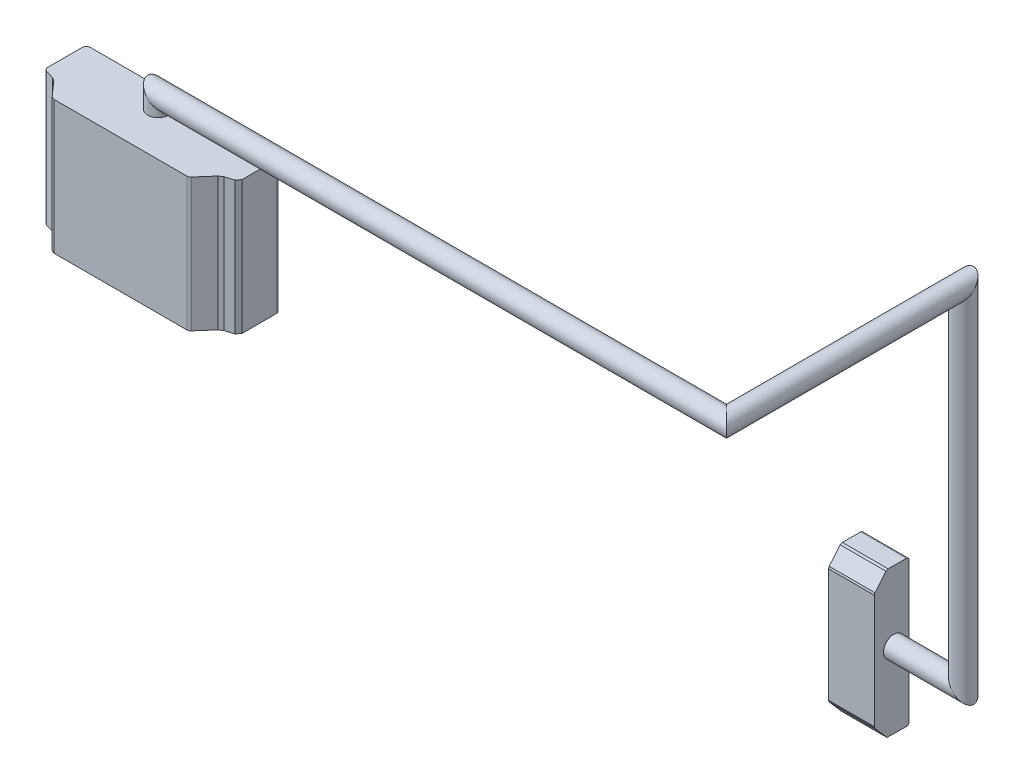
ISO-10303-21;
HEADER;
FILE_DESCRIPTION(('STEP AP214'),'2;1');
FILE_NAME('part.step','',(''),(''),'','','');
FILE_SCHEMA(('AUTOMOTIVE_DESIGN { 1 0 10303 214 1 1 1 1 }'));
ENDSEC;
DATA;
#1=APPLICATION_CONTEXT('core data for automotive mechanical design processes');
#2=APPLICATION_PROTOCOL_DEFINITION('international standard','automotive_design',2000,#1);
#3=PRODUCT_CONTEXT('',#1,'mechanical');
#4=PRODUCT('Part','Part','',(#3));
#5=PRODUCT_RELATED_PRODUCT_CATEGORY('part','',(#4));
#6=PRODUCT_DEFINITION_FORMATION('','',#4);
#7=PRODUCT_DEFINITION_CONTEXT('part definition',#1,'design');
#8=PRODUCT_DEFINITION('design','',#6,#7);
#9=PRODUCT_DEFINITION_SHAPE('','',#8);
#10=(LENGTH_UNIT() NAMED_UNIT(*) SI_UNIT(.MILLI.,.METRE.));
#11=(NAMED_UNIT(*) PLANE_ANGLE_UNIT() SI_UNIT($,.RADIAN.));
#12=(NAMED_UNIT(*) SI_UNIT($,.STERADIAN.) SOLID_ANGLE_UNIT());
#13=UNCERTAINTY_MEASURE_WITH_UNIT(LENGTH_MEASURE(1.E-05),#10,'distance_accuracy_value','');
#14=(GEOMETRIC_REPRESENTATION_CONTEXT(3) GLOBAL_UNCERTAINTY_ASSIGNED_CONTEXT((#13)) GLOBAL_UNIT_ASSIGNED_CONTEXT((#10,
#11,#12)) REPRESENTATION_CONTEXT('',''));
#15=CARTESIAN_POINT('',(0.,0.,0.));
#16=DIRECTION('',(0.,0.,1.));
#17=DIRECTION('',(1.,0.,0.));
#18=AXIS2_PLACEMENT_3D('',#15,#16,#17);
#19=CARTESIAN_POINT('',(-35.94,25.995,17.06));
#20=DIRECTION('',(0.,-1.,0.));
#21=DIRECTION('',(0.,0.,-1.));
#22=AXIS2_PLACEMENT_3D('',#19,#20,#21);
#23=CYLINDRICAL_SURFACE('',#22,0.75);
#24=CARTESIAN_POINT('',(-35.94,25.07,17.06));
#25=DIRECTION('',(-0.707106781186548,-0.707106781186548,0.));
#26=DIRECTION('',(-0.707106781186548,0.707106781186548,0.));
#27=AXIS2_PLACEMENT_3D('',#24,#25,#26);
#28=ELLIPSE('',#27,1.06066017177982,0.75);
#29=CARTESIAN_POINT('',(-36.69,25.82,17.06));
#30=VERTEX_POINT('',#29);
#31=EDGE_CURVE('E271',#30,#30,#28,.F.);
#32=ORIENTED_EDGE('',*,*,#31,.F.);
#33=EDGE_LOOP('',(#32));
#34=FACE_BOUND('',#33,.T.);
#35=CARTESIAN_POINT('',(-35.94,24.07,17.06));
#36=DIRECTION('',(0.,-1.,0.));
#37=DIRECTION('',(-1.,0.,0.));
#38=AXIS2_PLACEMENT_3D('',#35,#36,#37);
#39=CIRCLE('',#38,0.75);
#40=CARTESIAN_POINT('',(-36.69,24.07,17.06));
#41=VERTEX_POINT('',#40);
#42=EDGE_CURVE('E46',#41,#41,#39,.T.);
#43=ORIENTED_EDGE('',*,*,#42,.F.);
#44=EDGE_LOOP('',(#43));
#45=FACE_BOUND('',#44,.T.);
#46=ADVANCED_FACE('F43',(#34,#45),#23,.T.);
#47=CARTESIAN_POINT('',(6.75000000000001,25.07,17.06));
#48=DIRECTION('',(-1.,0.,0.));
#49=DIRECTION('',(0.,0.,1.));
#50=AXIS2_PLACEMENT_3D('',#47,#48,#49);
#51=CYLINDRICAL_SURFACE('',#50,0.75);
#52=CARTESIAN_POINT('',(5.,25.07,17.06));
#53=DIRECTION('',(-0.707106781186547,0.,0.707106781186548));
#54=DIRECTION('',(0.707106781186548,0.,0.707106781186547));
#55=AXIS2_PLACEMENT_3D('',#52,#53,#54);
#56=ELLIPSE('',#55,1.06066017177982,0.75);
#57=CARTESIAN_POINT('',(5.75,25.07,17.81));
#58=VERTEX_POINT('',#57);
#59=EDGE_CURVE('E269',#58,#58,#56,.F.);
#60=ORIENTED_EDGE('',*,*,#59,.F.);
#61=EDGE_LOOP('',(#60));
#62=FACE_BOUND('',#61,.T.);
#63=ORIENTED_EDGE('',*,*,#31,.T.);
#64=EDGE_LOOP('',(#63));
#65=FACE_BOUND('',#64,.T.);
#66=ADVANCED_FACE('F282',(#62,#65),#51,.T.);
#67=CARTESIAN_POINT('',(5.,25.07,-0.924999999999997));
#68=DIRECTION('',(0.,0.,1.));
#69=DIRECTION('',(1.,0.,0.));
#70=AXIS2_PLACEMENT_3D('',#67,#68,#69);
#71=CYLINDRICAL_SURFACE('',#70,0.75);
#72=CARTESIAN_POINT('',(5.,25.07,0.));
#73=DIRECTION('',(0.,0.707106781186548,0.707106781186548));
#74=DIRECTION('',(0.,0.707106781186548,-0.707106781186548));
#75=AXIS2_PLACEMENT_3D('',#72,#73,#74);
#76=ELLIPSE('',#75,1.06066017177982,0.75);
#77=CARTESIAN_POINT('',(5.,25.82,-0.75));
#78=VERTEX_POINT('',#77);
#79=EDGE_CURVE('E52',#78,#78,#76,.F.);
#80=ORIENTED_EDGE('',*,*,#79,.F.);
#81=EDGE_LOOP('',(#80));
#82=FACE_BOUND('',#81,.T.);
#83=ORIENTED_EDGE('',*,*,#59,.T.);
#84=EDGE_LOOP('',(#83));
#85=FACE_BOUND('',#84,.T.);
#86=ADVANCED_FACE('F288',(#82,#85),#71,.T.);
#87=CARTESIAN_POINT('',(5.,-1.75,0.));
#88=DIRECTION('',(0.,1.,0.));
#89=DIRECTION('',(0.,0.,1.));
#90=AXIS2_PLACEMENT_3D('',#87,#88,#89);
#91=CYLINDRICAL_SURFACE('',#90,0.75);
#92=CARTESIAN_POINT('',(5.,0.,0.));
#93=DIRECTION('',(0.707106781186548,0.707106781186548,0.));
#94=DIRECTION('',(0.707106781186548,-0.707106781186548,0.));
#95=AXIS2_PLACEMENT_3D('',#92,#93,#94);
#96=ELLIPSE('',#95,1.06066017177982,0.75);
#97=CARTESIAN_POINT('',(5.75,-0.75,0.));
#98=VERTEX_POINT('',#97);
#99=EDGE_CURVE('E11',#98,#98,#96,.F.);
#100=ORIENTED_EDGE('',*,*,#99,.F.);
#101=EDGE_LOOP('',(#100));
#102=FACE_BOUND('',#101,.T.);
#103=ORIENTED_EDGE('',*,*,#79,.T.);
#104=EDGE_LOOP('',(#103));
#105=FACE_BOUND('',#104,.T.);
#106=ADVANCED_FACE('F296',(#102,#105),#91,.T.);
#107=CARTESIAN_POINT('',(0.,0.,0.));
#108=DIRECTION('',(1.,0.,0.));
#109=DIRECTION('',(0.,0.,-1.));
#110=AXIS2_PLACEMENT_3D('',#107,#108,#109);
#111=CYLINDRICAL_SURFACE('',#110,0.75);
#112=CARTESIAN_POINT('',(0.,0.,0.));
#113=DIRECTION('',(1.,0.,0.));
#114=DIRECTION('',(0.,0.,-1.));
#115=AXIS2_PLACEMENT_3D('',#112,#113,#114);
#116=CIRCLE('',#115,0.75);
#117=CARTESIAN_POINT('',(0.,0.,-0.75));
#118=VERTEX_POINT('',#117);
#119=EDGE_CURVE('E198',#118,#118,#116,.T.);
#120=ORIENTED_EDGE('',*,*,#119,.T.);
#121=EDGE_LOOP('',(#120));
#122=FACE_BOUND('',#121,.T.);
#123=ORIENTED_EDGE('',*,*,#99,.T.);
#124=EDGE_LOOP('',(#123));
#125=FACE_BOUND('',#124,.T.);
#126=ADVANCED_FACE('F292',(#122,#125),#111,.T.);
#127=CARTESIAN_POINT('',(-28.8290699893797,14.47,15.9518178306034));
#128=DIRECTION('',(0.,1.,0.));
#129=DIRECTION('',(0.,0.,1.));
#130=AXIS2_PLACEMENT_3D('',#127,#128,#129);
#131=CYLINDRICAL_SURFACE('',#130,0.300000000000014);
#132=CARTESIAN_POINT('',(-28.8290699893797,24.07,15.9518178306034));
#133=DIRECTION('',(0.,-1.,0.));
#134=DIRECTION('',(0.,0.,-1.));
#135=AXIS2_PLACEMENT_3D('',#132,#133,#134);
#136=CIRCLE('',#135,0.300000000000014);
#137=CARTESIAN_POINT('',(-28.8290699893797,24.07,15.6518178306034));
#138=VERTEX_POINT('',#137);
#139=CARTESIAN_POINT('',(-28.5290699893797,24.07,15.9518178306034));
#140=VERTEX_POINT('',#139);
#141=EDGE_CURVE('E194',#138,#140,#136,.T.);
#142=ORIENTED_EDGE('',*,*,#141,.T.);
#143=DIRECTION('',(0.,1.,0.));
#144=VECTOR('',#143,1.);
#145=CARTESIAN_POINT('',(-28.5290699893797,14.47,15.9518178306034));
#146=LINE('',#145,#144);
#147=CARTESIAN_POINT('',(-28.5290699893797,14.47,15.9518178306034));
#148=VERTEX_POINT('',#147);
#149=EDGE_CURVE('E262',#148,#140,#146,.T.);
#150=ORIENTED_EDGE('',*,*,#149,.F.);
#151=CARTESIAN_POINT('',(-28.8290699893797,14.47,15.9518178306034));
#152=DIRECTION('',(0.,-1.,0.));
#153=DIRECTION('',(0.,0.,-1.));
#154=AXIS2_PLACEMENT_3D('',#151,#152,#153);
#155=CIRCLE('',#154,0.300000000000014);
#156=CARTESIAN_POINT('',(-28.8290699893797,14.47,15.6518178306034));
#157=VERTEX_POINT('',#156);
#158=EDGE_CURVE('E225',#157,#148,#155,.T.);
#159=ORIENTED_EDGE('',*,*,#158,.F.);
#160=DIRECTION('',(0.,1.,0.));
#161=VECTOR('',#160,1.);
#162=CARTESIAN_POINT('',(-28.8290699893797,14.47,15.6518178306034));
#163=LINE('',#162,#161);
#164=EDGE_CURVE('E190',#157,#138,#163,.T.);
#165=ORIENTED_EDGE('',*,*,#164,.T.);
#166=EDGE_LOOP('',(#142,#150,#159,#165));
#167=FACE_BOUND('',#166,.T.);
#168=ADVANCED_FACE('F284',(#167),#131,.T.);
#169=CARTESIAN_POINT('',(-28.5290699893797,14.47,15.9518178306034));
#170=DIRECTION('',(-1.,0.,0.));
#171=DIRECTION('',(0.,0.,1.));
#172=AXIS2_PLACEMENT_3D('',#169,#170,#171);
#173=PLANE('',#172);
#174=DIRECTION('',(0.,0.,1.));
#175=VECTOR('',#174,1.);
#176=CARTESIAN_POINT('',(-28.5290699893797,24.07,15.9518178306034));
#177=LINE('',#176,#175);
#178=CARTESIAN_POINT('',(-28.5290699893797,24.07,18.4302454308662));
#179=VERTEX_POINT('',#178);
#180=EDGE_CURVE('E197',#140,#179,#177,.T.);
#181=ORIENTED_EDGE('',*,*,#180,.T.);
#182=DIRECTION('',(0.,1.,0.));
#183=VECTOR('',#182,1.);
#184=CARTESIAN_POINT('',(-28.5290699893797,14.47,18.4302454308662));
#185=LINE('',#184,#183);
#186=CARTESIAN_POINT('',(-28.5290699893797,14.47,18.4302454308662));
#187=VERTEX_POINT('',#186);
#188=EDGE_CURVE('E259',#187,#179,#185,.T.);
#189=ORIENTED_EDGE('',*,*,#188,.F.);
#190=DIRECTION('',(0.,0.,1.));
#191=VECTOR('',#190,1.);
#192=CARTESIAN_POINT('',(-28.5290699893797,14.47,15.9518178306034));
#193=LINE('',#192,#191);
#194=EDGE_CURVE('E130',#148,#187,#193,.T.);
#195=ORIENTED_EDGE('',*,*,#194,.F.);
#196=ORIENTED_EDGE('',*,*,#149,.T.);
#197=EDGE_LOOP('',(#181,#189,#195,#196));
#198=FACE_BOUND('',#197,.T.);
#199=ADVANCED_FACE('F291',(#198),#173,.F.);
#200=CARTESIAN_POINT('',(-28.5290699893797,14.47,18.4302454308662));
#201=DIRECTION('',(-0.80438978389005,0.,-0.594101906724191));
#202=DIRECTION('',(-0.594101906724191,0.,0.80438978389005));
#203=AXIS2_PLACEMENT_3D('',#200,#201,#202);
#204=PLANE('',#203);
#205=DIRECTION('',(-0.594101906724191,0.,0.80438978389005));
#206=VECTOR('',#205,1.);
#207=CARTESIAN_POINT('',(-28.5290699893797,24.07,18.4302454308662));
#208=LINE('',#207,#206);
#209=CARTESIAN_POINT('',(-28.7408442347238,24.07,18.7169791334813));
#210=VERTEX_POINT('',#209);
#211=EDGE_CURVE('E200',#179,#210,#208,.T.);
#212=ORIENTED_EDGE('',*,*,#211,.T.);
#213=DIRECTION('',(0.,1.,0.));
#214=VECTOR('',#213,1.);
#215=CARTESIAN_POINT('',(-28.7408442347238,14.47,18.7169791334813));
#216=LINE('',#215,#214);
#217=CARTESIAN_POINT('',(-28.7408442347238,14.47,18.7169791334813));
#218=VERTEX_POINT('',#217);
#219=EDGE_CURVE('E256',#218,#210,#216,.T.);
#220=ORIENTED_EDGE('',*,*,#219,.F.);
#221=DIRECTION('',(-0.594101906724191,0.,0.80438978389005));
#222=VECTOR('',#221,1.);
#223=CARTESIAN_POINT('',(-28.5290699893797,14.47,18.4302454308662));
#224=LINE('',#223,#222);
#225=EDGE_CURVE('E707',#187,#218,#224,.T.);
#226=ORIENTED_EDGE('',*,*,#225,.F.);
#227=ORIENTED_EDGE('',*,*,#188,.T.);
#228=EDGE_LOOP('',(#212,#220,#226,#227));
#229=FACE_BOUND('',#228,.T.);
#230=ADVANCED_FACE('F342',(#229),#204,.F.);
#231=CARTESIAN_POINT('',(-28.7408442347238,14.47,18.7169791334813));
#232=DIRECTION('',(-0.294085848853316,0.,-0.955779008717091));
#233=DIRECTION('',(-0.955779008717091,0.,0.294085848853316));
#234=AXIS2_PLACEMENT_3D('',#231,#232,#233);
#235=PLANE('',#234);
#236=DIRECTION('',(-0.955779008717091,0.,0.294085848853316));
#237=VECTOR('',#236,1.);
#238=CARTESIAN_POINT('',(-28.7408442347238,24.07,18.7169791334813));
#239=LINE('',#238,#237);
#240=CARTESIAN_POINT('',(-29.3555681996219,24.07,18.9061249688457));
#241=VERTEX_POINT('',#240);
#242=EDGE_CURVE('E202',#210,#241,#239,.T.);
#243=ORIENTED_EDGE('',*,*,#242,.T.);
#244=DIRECTION('',(0.,1.,0.));
#245=VECTOR('',#244,1.);
#246=CARTESIAN_POINT('',(-29.3555681996219,14.47,18.9061249688457));
#247=LINE('',#246,#245);
#248=CARTESIAN_POINT('',(-29.3555681996219,14.47,18.9061249688457));
#249=VERTEX_POINT('',#248);
#250=EDGE_CURVE('E253',#249,#241,#247,.T.);
#251=ORIENTED_EDGE('',*,*,#250,.F.);
#252=DIRECTION('',(-0.955779008717091,0.,0.294085848853316));
#253=VECTOR('',#252,1.);
#254=CARTESIAN_POINT('',(-28.7408442347238,14.47,18.7169791334813));
#255=LINE('',#254,#253);
#256=EDGE_CURVE('E709',#218,#249,#255,.T.);
#257=ORIENTED_EDGE('',*,*,#256,.F.);
#258=ORIENTED_EDGE('',*,*,#219,.T.);
#259=EDGE_LOOP('',(#243,#251,#257,#258));
#260=FACE_BOUND('',#259,.T.);
#261=ADVANCED_FACE('F350',(#260),#235,.F.);
#262=CARTESIAN_POINT('',(-29.3555681996219,14.47,18.9061249688457));
#263=DIRECTION('',(-0.542844336506485,0.,-0.839833332467123));
#264=DIRECTION('',(-0.839833332467123,0.,0.542844336506485));
#265=AXIS2_PLACEMENT_3D('',#262,#263,#264);
#266=PLANE('',#265);
#267=DIRECTION('',(-0.839833332467123,0.,0.542844336506485));
#268=VECTOR('',#267,1.);
#269=CARTESIAN_POINT('',(-29.3555681996219,24.07,18.9061249688457));
#270=LINE('',#269,#268);
#271=CARTESIAN_POINT('',(-29.606713417058,24.07,19.0684580814472));
#272=VERTEX_POINT('',#271);
#273=EDGE_CURVE('E204',#241,#272,#270,.T.);
#274=ORIENTED_EDGE('',*,*,#273,.T.);
#275=DIRECTION('',(0.,1.,0.));
#276=VECTOR('',#275,1.);
#277=CARTESIAN_POINT('',(-29.606713417058,14.47,19.0684580814472));
#278=LINE('',#277,#276);
#279=CARTESIAN_POINT('',(-29.606713417058,14.47,19.0684580814472));
#280=VERTEX_POINT('',#279);
#281=EDGE_CURVE('E250',#280,#272,#278,.T.);
#282=ORIENTED_EDGE('',*,*,#281,.F.);
#283=DIRECTION('',(-0.839833332467123,0.,0.542844336506485));
#284=VECTOR('',#283,1.);
#285=CARTESIAN_POINT('',(-29.3555681996219,14.47,18.9061249688457));
#286=LINE('',#285,#284);
#287=EDGE_CURVE('E711',#249,#280,#286,.T.);
#288=ORIENTED_EDGE('',*,*,#287,.F.);
#289=ORIENTED_EDGE('',*,*,#250,.T.);
#290=EDGE_LOOP('',(#274,#282,#288,#289));
#291=FACE_BOUND('',#290,.T.);
#292=ADVANCED_FACE('F360',(#291),#266,.F.);
#293=CARTESIAN_POINT('',(-29.606713417058,14.47,19.0684580814472));
#294=DIRECTION('',(-0.750713516919198,0.,-0.660627894896068));
#295=DIRECTION('',(-0.660627894896068,0.,0.750713516919198));
#296=AXIS2_PLACEMENT_3D('',#293,#294,#295);
#297=PLANE('',#296);
#298=DIRECTION('',(-0.660627894896068,0.,0.750713516919198));
#299=VECTOR('',#298,1.);
#300=CARTESIAN_POINT('',(-29.606713417058,24.07,19.0684580814472));
#301=LINE('',#300,#299);
#302=CARTESIAN_POINT('',(-30.5144757568725,24.07,20.1000061948615));
#303=VERTEX_POINT('',#302);
#304=EDGE_CURVE('E206',#272,#303,#301,.T.);
#305=ORIENTED_EDGE('',*,*,#304,.T.);
#306=DIRECTION('',(0.,1.,0.));
#307=VECTOR('',#306,1.);
#308=CARTESIAN_POINT('',(-30.5144757568725,14.47,20.1000061948615));
#309=LINE('',#308,#307);
#310=CARTESIAN_POINT('',(-30.5144757568725,14.47,20.1000061948615));
#311=VERTEX_POINT('',#310);
#312=EDGE_CURVE('E247',#311,#303,#309,.T.);
#313=ORIENTED_EDGE('',*,*,#312,.F.);
#314=DIRECTION('',(-0.660627894896068,0.,0.750713516919198));
#315=VECTOR('',#314,1.);
#316=CARTESIAN_POINT('',(-29.606713417058,14.47,19.0684580814472));
#317=LINE('',#316,#315);
#318=EDGE_CURVE('E713',#280,#311,#317,.T.);
#319=ORIENTED_EDGE('',*,*,#318,.F.);
#320=ORIENTED_EDGE('',*,*,#281,.T.);
#321=EDGE_LOOP('',(#305,#313,#319,#320));
#322=FACE_BOUND('',#321,.T.);
#323=ADVANCED_FACE('F370',(#322),#297,.F.);
#324=CARTESIAN_POINT('',(-30.7396898119482,14.47,19.9018178263927));
#325=DIRECTION('',(0.,1.,0.));
#326=DIRECTION('',(0.,0.,1.));
#327=AXIS2_PLACEMENT_3D('',#324,#325,#326);
#328=CYLINDRICAL_SURFACE('',#327,0.299999999999984);
#329=CARTESIAN_POINT('',(-30.7396898119482,24.07,19.9018178263927));
#330=DIRECTION('',(0.,-1.,0.));
#331=DIRECTION('',(0.,0.,-1.));
#332=AXIS2_PLACEMENT_3D('',#329,#330,#331);
#333=CIRCLE('',#332,0.299999999999984);
#334=CARTESIAN_POINT('',(-30.7396898119482,24.07,20.2018178263927));
#335=VERTEX_POINT('',#334);
#336=EDGE_CURVE('E208',#303,#335,#333,.T.);
#337=ORIENTED_EDGE('',*,*,#336,.T.);
#338=DIRECTION('',(0.,1.,0.));
#339=VECTOR('',#338,1.);
#340=CARTESIAN_POINT('',(-30.7396898119482,14.47,20.2018178263927));
#341=LINE('',#340,#339);
#342=CARTESIAN_POINT('',(-30.7396898119482,14.47,20.2018178263927));
#343=VERTEX_POINT('',#342);
#344=EDGE_CURVE('E244',#343,#335,#341,.T.);
#345=ORIENTED_EDGE('',*,*,#344,.F.);
#346=CARTESIAN_POINT('',(-30.7396898119482,14.47,19.9018178263927));
#347=DIRECTION('',(0.,-1.,0.));
#348=DIRECTION('',(0.,0.,-1.));
#349=AXIS2_PLACEMENT_3D('',#346,#347,#348);
#350=CIRCLE('',#349,0.299999999999984);
#351=EDGE_CURVE('E715',#311,#343,#350,.T.);
#352=ORIENTED_EDGE('',*,*,#351,.F.);
#353=ORIENTED_EDGE('',*,*,#312,.T.);
#354=EDGE_LOOP('',(#337,#345,#352,#353));
#355=FACE_BOUND('',#354,.T.);
#356=ADVANCED_FACE('F380',(#355),#328,.T.);
#357=CARTESIAN_POINT('',(-30.7396898119482,14.47,20.2018178263927));
#358=DIRECTION('',(0.,0.,-1.));
#359=DIRECTION('',(0.,1.,0.));
#360=AXIS2_PLACEMENT_3D('',#357,#358,#359);
#361=PLANE('',#360);
#362=DIRECTION('',(-1.,0.,0.));
#363=VECTOR('',#362,1.);
#364=CARTESIAN_POINT('',(-30.7396898119482,24.07,20.2018178263927));
#365=LINE('',#364,#363);
#366=CARTESIAN_POINT('',(-40.3184501668114,24.07,20.2018178263927));
#367=VERTEX_POINT('',#366);
#368=EDGE_CURVE('E210',#335,#367,#365,.T.);
#369=ORIENTED_EDGE('',*,*,#368,.T.);
#370=DIRECTION('',(0.,1.,0.));
#371=VECTOR('',#370,1.);
#372=CARTESIAN_POINT('',(-40.3184501668114,14.47,20.2018178263927));
#373=LINE('',#372,#371);
#374=CARTESIAN_POINT('',(-40.3184501668114,14.47,20.2018178263927));
#375=VERTEX_POINT('',#374);
#376=EDGE_CURVE('E241',#375,#367,#373,.T.);
#377=ORIENTED_EDGE('',*,*,#376,.F.);
#378=DIRECTION('',(-1.,0.,0.));
#379=VECTOR('',#378,1.);
#380=CARTESIAN_POINT('',(-30.7396898119482,14.47,20.2018178263927));
#381=LINE('',#380,#379);
#382=EDGE_CURVE('E717',#343,#375,#381,.T.);
#383=ORIENTED_EDGE('',*,*,#382,.F.);
#384=ORIENTED_EDGE('',*,*,#344,.T.);
#385=EDGE_LOOP('',(#369,#377,#383,#384));
#386=FACE_BOUND('',#385,.T.);
#387=ADVANCED_FACE('F390',(#386),#361,.F.);
#388=CARTESIAN_POINT('',(-40.3184501668114,14.47,20.2018178263927));
#389=DIRECTION('',(0.411929669424208,0.,-0.911215642670857));
#390=DIRECTION('',(-0.911215642670857,0.,-0.411929669424208));
#391=AXIS2_PLACEMENT_3D('',#388,#389,#390);
#392=PLANE('',#391);
#393=DIRECTION('',(-0.911215642670857,0.,-0.411929669424208));
#394=VECTOR('',#393,1.);
#395=CARTESIAN_POINT('',(-40.3184501668114,24.07,20.2018178263927));
#396=LINE('',#395,#394);
#397=CARTESIAN_POINT('',(-40.5436642218871,24.07,20.1000061948616));
#398=VERTEX_POINT('',#397);
#399=EDGE_CURVE('E212',#367,#398,#396,.T.);
#400=ORIENTED_EDGE('',*,*,#399,.T.);
#401=DIRECTION('',(0.,1.,0.));
#402=VECTOR('',#401,1.);
#403=CARTESIAN_POINT('',(-40.5436642218871,14.47,20.1000061948616));
#404=LINE('',#403,#402);
#405=CARTESIAN_POINT('',(-40.5436642218871,14.47,20.1000061948616));
#406=VERTEX_POINT('',#405);
#407=EDGE_CURVE('E238',#406,#398,#404,.T.);
#408=ORIENTED_EDGE('',*,*,#407,.F.);
#409=DIRECTION('',(-0.911215642670857,0.,-0.411929669424208));
#410=VECTOR('',#409,1.);
#411=CARTESIAN_POINT('',(-40.3184501668114,14.47,20.2018178263927));
#412=LINE('',#411,#410);
#413=EDGE_CURVE('E719',#375,#406,#412,.T.);
#414=ORIENTED_EDGE('',*,*,#413,.F.);
#415=ORIENTED_EDGE('',*,*,#376,.T.);
#416=EDGE_LOOP('',(#400,#408,#414,#415));
#417=FACE_BOUND('',#416,.T.);
#418=ADVANCED_FACE('F400',(#417),#392,.F.);
#419=CARTESIAN_POINT('',(-40.5436642218871,14.47,20.1000061948616));
#420=DIRECTION('',(0.750713516919223,0.,-0.660627894896038));
#421=DIRECTION('',(-0.660627894896038,0.,-0.750713516919224));
#422=AXIS2_PLACEMENT_3D('',#419,#420,#421);
#423=PLANE('',#422);
#424=DIRECTION('',(-0.660627894896038,0.,-0.750713516919223));
#425=VECTOR('',#424,1.);
#426=CARTESIAN_POINT('',(-40.5436642218871,24.07,20.1000061948616));
#427=LINE('',#426,#425);
#428=CARTESIAN_POINT('',(-41.4514265617014,24.07,19.0684580814473));
#429=VERTEX_POINT('',#428);
#430=EDGE_CURVE('E214',#398,#429,#427,.T.);
#431=ORIENTED_EDGE('',*,*,#430,.T.);
#432=DIRECTION('',(0.,1.,0.));
#433=VECTOR('',#432,1.);
#434=CARTESIAN_POINT('',(-41.4514265617014,14.47,19.0684580814473));
#435=LINE('',#434,#433);
#436=CARTESIAN_POINT('',(-41.4514265617014,14.47,19.0684580814473));
#437=VERTEX_POINT('',#436);
#438=EDGE_CURVE('E235',#437,#429,#435,.T.);
#439=ORIENTED_EDGE('',*,*,#438,.F.);
#440=DIRECTION('',(-0.660627894896038,0.,-0.750713516919223));
#441=VECTOR('',#440,1.);
#442=CARTESIAN_POINT('',(-40.5436642218871,14.47,20.1000061948616));
#443=LINE('',#442,#441);
#444=EDGE_CURVE('E721',#406,#437,#443,.T.);
#445=ORIENTED_EDGE('',*,*,#444,.F.);
#446=ORIENTED_EDGE('',*,*,#407,.T.);
#447=EDGE_LOOP('',(#431,#439,#445,#446));
#448=FACE_BOUND('',#447,.T.);
#449=ADVANCED_FACE('F410',(#448),#423,.F.);
#450=CARTESIAN_POINT('',(-41.4514265617014,14.47,19.0684580814473));
#451=DIRECTION('',(0.542844336506474,0.,-0.839833332467131));
#452=DIRECTION('',(-0.839833332467131,0.,-0.542844336506474));
#453=AXIS2_PLACEMENT_3D('',#450,#451,#452);
#454=PLANE('',#453);
#455=DIRECTION('',(-0.839833332467131,0.,-0.542844336506474));
#456=VECTOR('',#455,1.);
#457=CARTESIAN_POINT('',(-41.4514265617014,24.07,19.0684580814473));
#458=LINE('',#457,#456);
#459=CARTESIAN_POINT('',(-41.7025717791376,24.07,18.9061249688458));
#460=VERTEX_POINT('',#459);
#461=EDGE_CURVE('E216',#429,#460,#458,.T.);
#462=ORIENTED_EDGE('',*,*,#461,.T.);
#463=DIRECTION('',(0.,1.,0.));
#464=VECTOR('',#463,1.);
#465=CARTESIAN_POINT('',(-41.7025717791376,14.47,18.9061249688458));
#466=LINE('',#465,#464);
#467=CARTESIAN_POINT('',(-41.7025717791376,14.47,18.9061249688458));
#468=VERTEX_POINT('',#467);
#469=EDGE_CURVE('E232',#468,#460,#466,.T.);
#470=ORIENTED_EDGE('',*,*,#469,.F.);
#471=DIRECTION('',(-0.839833332467131,0.,-0.542844336506474));
#472=VECTOR('',#471,1.);
#473=CARTESIAN_POINT('',(-41.4514265617014,14.47,19.0684580814473));
#474=LINE('',#473,#472);
#475=EDGE_CURVE('E723',#437,#468,#474,.T.);
#476=ORIENTED_EDGE('',*,*,#475,.F.);
#477=ORIENTED_EDGE('',*,*,#438,.T.);
#478=EDGE_LOOP('',(#462,#470,#476,#477));
#479=FACE_BOUND('',#478,.T.);
#480=ADVANCED_FACE('F420',(#479),#454,.F.);
#481=CARTESIAN_POINT('',(-41.7025717791376,14.47,18.9061249688458));
#482=DIRECTION('',(0.294085848853305,0.,-0.955779008717094));
#483=DIRECTION('',(-0.955779008717094,0.,-0.294085848853305));
#484=AXIS2_PLACEMENT_3D('',#481,#482,#483);
#485=PLANE('',#484);
#486=DIRECTION('',(-0.955779008717094,0.,-0.294085848853305));
#487=VECTOR('',#486,1.);
#488=CARTESIAN_POINT('',(-41.7025717791376,24.07,18.9061249688458));
#489=LINE('',#488,#487);
#490=CARTESIAN_POINT('',(-42.3172957440357,24.07,18.7169791334814));
#491=VERTEX_POINT('',#490);
#492=EDGE_CURVE('E218',#460,#491,#489,.T.);
#493=ORIENTED_EDGE('',*,*,#492,.T.);
#494=DIRECTION('',(0.,1.,0.));
#495=VECTOR('',#494,1.);
#496=CARTESIAN_POINT('',(-42.3172957440357,14.47,18.7169791334814));
#497=LINE('',#496,#495);
#498=CARTESIAN_POINT('',(-42.3172957440357,14.47,18.7169791334814));
#499=VERTEX_POINT('',#498);
#500=EDGE_CURVE('E229',#499,#491,#497,.T.);
#501=ORIENTED_EDGE('',*,*,#500,.F.);
#502=DIRECTION('',(-0.955779008717094,0.,-0.294085848853305));
#503=VECTOR('',#502,1.);
#504=CARTESIAN_POINT('',(-41.7025717791376,14.47,18.9061249688458));
#505=LINE('',#504,#503);
#506=EDGE_CURVE('E725',#468,#499,#505,.T.);
#507=ORIENTED_EDGE('',*,*,#506,.F.);
#508=ORIENTED_EDGE('',*,*,#469,.T.);
#509=EDGE_LOOP('',(#493,#501,#507,#508));
#510=FACE_BOUND('',#509,.T.);
#511=ADVANCED_FACE('F430',(#510),#485,.F.);
#512=CARTESIAN_POINT('',(-42.2290699893797,14.47,18.4302454308662));
#513=DIRECTION('',(0.,1.,0.));
#514=DIRECTION('',(0.,0.,1.));
#515=AXIS2_PLACEMENT_3D('',#512,#513,#514);
#516=CYLINDRICAL_SURFACE('',#515,0.300000000000037);
#517=CARTESIAN_POINT('',(-42.2290699893797,24.07,18.4302454308662));
#518=DIRECTION('',(0.,-1.,0.));
#519=DIRECTION('',(0.,0.,-1.));
#520=AXIS2_PLACEMENT_3D('',#517,#518,#519);
#521=CIRCLE('',#520,0.300000000000037);
#522=CARTESIAN_POINT('',(-42.5290699893798,24.07,18.4302454308662));
#523=VERTEX_POINT('',#522);
#524=EDGE_CURVE('E220',#491,#523,#521,.T.);
#525=ORIENTED_EDGE('',*,*,#524,.T.);
#526=DIRECTION('',(0.,1.,0.));
#527=VECTOR('',#526,1.);
#528=CARTESIAN_POINT('',(-42.5290699893798,14.47,18.4302454308662));
#529=LINE('',#528,#527);
#530=CARTESIAN_POINT('',(-42.5290699893798,14.47,18.4302454308662));
#531=VERTEX_POINT('',#530);
#532=EDGE_CURVE('E185',#531,#523,#529,.T.);
#533=ORIENTED_EDGE('',*,*,#532,.F.);
#534=CARTESIAN_POINT('',(-42.2290699893797,14.47,18.4302454308662));
#535=DIRECTION('',(0.,-1.,0.));
#536=DIRECTION('',(0.,0.,-1.));
#537=AXIS2_PLACEMENT_3D('',#534,#535,#536);
#538=CIRCLE('',#537,0.300000000000037);
#539=EDGE_CURVE('E176',#499,#531,#538,.T.);
#540=ORIENTED_EDGE('',*,*,#539,.F.);
#541=ORIENTED_EDGE('',*,*,#500,.T.);
#542=EDGE_LOOP('',(#525,#533,#540,#541));
#543=FACE_BOUND('',#542,.T.);
#544=ADVANCED_FACE('F440',(#543),#516,.T.);
#545=CARTESIAN_POINT('',(-42.5290699893798,14.47,18.4302454308662));
#546=DIRECTION('',(1.,0.,0.));
#547=DIRECTION('',(0.,1.,0.));
#548=AXIS2_PLACEMENT_3D('',#545,#546,#547);
#549=PLANE('',#548);
#550=DIRECTION('',(0.,0.,-1.));
#551=VECTOR('',#550,1.);
#552=CARTESIAN_POINT('',(-42.5290699893798,24.07,18.4302454308662));
#553=LINE('',#552,#551);
#554=CARTESIAN_POINT('',(-42.5290699893798,24.07,15.9518178306034));
#555=VERTEX_POINT('',#554);
#556=EDGE_CURVE('E184',#523,#555,#553,.T.);
#557=ORIENTED_EDGE('',*,*,#556,.T.);
#558=DIRECTION('',(0.,1.,0.));
#559=VECTOR('',#558,1.);
#560=CARTESIAN_POINT('',(-42.5290699893798,14.47,15.9518178306034));
#561=LINE('',#560,#559);
#562=CARTESIAN_POINT('',(-42.5290699893798,14.47,15.9518178306034));
#563=VERTEX_POINT('',#562);
#564=EDGE_CURVE('E181',#563,#555,#561,.T.);
#565=ORIENTED_EDGE('',*,*,#564,.F.);
#566=DIRECTION('',(0.,0.,-1.));
#567=VECTOR('',#566,1.);
#568=CARTESIAN_POINT('',(-42.5290699893798,14.47,18.4302454308662));
#569=LINE('',#568,#567);
#570=EDGE_CURVE('E170',#531,#563,#569,.T.);
#571=ORIENTED_EDGE('',*,*,#570,.F.);
#572=ORIENTED_EDGE('',*,*,#532,.T.);
#573=EDGE_LOOP('',(#557,#565,#571,#572));
#574=FACE_BOUND('',#573,.T.);
#575=ADVANCED_FACE('F182',(#574),#549,.F.);
#576=CARTESIAN_POINT('',(-42.2290699893798,14.47,15.9518178306034));
#577=DIRECTION('',(0.,1.,0.));
#578=DIRECTION('',(0.,0.,1.));
#579=AXIS2_PLACEMENT_3D('',#576,#577,#578);
#580=CYLINDRICAL_SURFACE('',#579,0.300000000000002);
#581=CARTESIAN_POINT('',(-42.2290699893798,24.07,15.9518178306034));
#582=DIRECTION('',(0.,-1.,0.));
#583=DIRECTION('',(0.,0.,-1.));
#584=AXIS2_PLACEMENT_3D('',#581,#582,#583);
#585=CIRCLE('',#584,0.300000000000002);
#586=CARTESIAN_POINT('',(-42.2290699893798,24.07,15.6518178306034));
#587=VERTEX_POINT('',#586);
#588=EDGE_CURVE('E115',#555,#587,#585,.T.);
#589=ORIENTED_EDGE('',*,*,#588,.T.);
#590=DIRECTION('',(0.,1.,0.));
#591=VECTOR('',#590,1.);
#592=CARTESIAN_POINT('',(-42.2290699893798,14.47,15.6518178306034));
#593=LINE('',#592,#591);
#594=CARTESIAN_POINT('',(-42.2290699893798,14.47,15.6518178306034));
#595=VERTEX_POINT('',#594);
#596=EDGE_CURVE('E186',#595,#587,#593,.T.);
#597=ORIENTED_EDGE('',*,*,#596,.F.);
#598=CARTESIAN_POINT('',(-42.2290699893798,14.47,15.9518178306034));
#599=DIRECTION('',(0.,-1.,0.));
#600=DIRECTION('',(0.,0.,-1.));
#601=AXIS2_PLACEMENT_3D('',#598,#599,#600);
#602=CIRCLE('',#601,0.300000000000002);
#603=EDGE_CURVE('E174',#563,#595,#602,.T.);
#604=ORIENTED_EDGE('',*,*,#603,.F.);
#605=ORIENTED_EDGE('',*,*,#564,.T.);
#606=EDGE_LOOP('',(#589,#597,#604,#605));
#607=FACE_BOUND('',#606,.T.);
#608=ADVANCED_FACE('F188',(#607),#580,.T.);
#609=CARTESIAN_POINT('',(-42.2290699893798,14.47,15.6518178306034));
#610=DIRECTION('',(0.,0.,1.));
#611=DIRECTION('',(0.,-1.,0.));
#612=AXIS2_PLACEMENT_3D('',#609,#610,#611);
#613=PLANE('',#612);
#614=DIRECTION('',(1.,0.,0.));
#615=VECTOR('',#614,1.);
#616=CARTESIAN_POINT('',(-42.2290699893798,24.07,15.6518178306034));
#617=LINE('',#616,#615);
#618=EDGE_CURVE('E121',#587,#138,#617,.T.);
#619=ORIENTED_EDGE('',*,*,#618,.T.);
#620=ORIENTED_EDGE('',*,*,#164,.F.);
#621=DIRECTION('',(1.,0.,0.));
#622=VECTOR('',#621,1.);
#623=CARTESIAN_POINT('',(-42.2290699893798,14.47,15.6518178306034));
#624=LINE('',#623,#622);
#625=EDGE_CURVE('E61',#595,#157,#624,.T.);
#626=ORIENTED_EDGE('',*,*,#625,.F.);
#627=ORIENTED_EDGE('',*,*,#596,.T.);
#628=EDGE_LOOP('',(#619,#620,#626,#627));
#629=FACE_BOUND('',#628,.T.);
#630=ADVANCED_FACE('F467',(#629),#613,.F.);
#631=CARTESIAN_POINT('',(-28.8290699893797,14.47,15.9518178306034));
#632=DIRECTION('',(0.,-1.,0.));
#633=DIRECTION('',(0.,0.,-1.));
#634=AXIS2_PLACEMENT_3D('',#631,#632,#633);
#635=PLANE('',#634);
#636=ORIENTED_EDGE('',*,*,#158,.T.);
#637=ORIENTED_EDGE('',*,*,#194,.T.);
#638=ORIENTED_EDGE('',*,*,#225,.T.);
#639=ORIENTED_EDGE('',*,*,#256,.T.);
#640=ORIENTED_EDGE('',*,*,#287,.T.);
#641=ORIENTED_EDGE('',*,*,#318,.T.);
#642=ORIENTED_EDGE('',*,*,#351,.T.);
#643=ORIENTED_EDGE('',*,*,#382,.T.);
#644=ORIENTED_EDGE('',*,*,#413,.T.);
#645=ORIENTED_EDGE('',*,*,#444,.T.);
#646=ORIENTED_EDGE('',*,*,#475,.T.);
#647=ORIENTED_EDGE('',*,*,#506,.T.);
#648=ORIENTED_EDGE('',*,*,#539,.T.);
#649=ORIENTED_EDGE('',*,*,#570,.T.);
#650=ORIENTED_EDGE('',*,*,#603,.T.);
#651=ORIENTED_EDGE('',*,*,#625,.T.);
#652=EDGE_LOOP('',(#636,#637,#638,#639,#640,#641,#642,#643,#644,#645,#646,#647,#648,#649,#650,#651));
#653=FACE_BOUND('',#652,.T.);
#654=ADVANCED_FACE('F172',(#653),#635,.T.);
#655=CARTESIAN_POINT('',(-28.8290699893797,24.07,15.9518178306034));
#656=DIRECTION('',(0.,-1.,0.));
#657=DIRECTION('',(0.,0.,-1.));
#658=AXIS2_PLACEMENT_3D('',#655,#656,#657);
#659=PLANE('',#658);
#660=ORIENTED_EDGE('',*,*,#42,.T.);
#661=EDGE_LOOP('',(#660));
#662=FACE_BOUND('',#661,.T.);
#663=ORIENTED_EDGE('',*,*,#141,.F.);
#664=ORIENTED_EDGE('',*,*,#618,.F.);
#665=ORIENTED_EDGE('',*,*,#588,.F.);
#666=ORIENTED_EDGE('',*,*,#556,.F.);
#667=ORIENTED_EDGE('',*,*,#524,.F.);
#668=ORIENTED_EDGE('',*,*,#492,.F.);
#669=ORIENTED_EDGE('',*,*,#461,.F.);
#670=ORIENTED_EDGE('',*,*,#430,.F.);
#671=ORIENTED_EDGE('',*,*,#399,.F.);
#672=ORIENTED_EDGE('',*,*,#368,.F.);
#673=ORIENTED_EDGE('',*,*,#336,.F.);
#674=ORIENTED_EDGE('',*,*,#304,.F.);
#675=ORIENTED_EDGE('',*,*,#273,.F.);
#676=ORIENTED_EDGE('',*,*,#242,.F.);
#677=ORIENTED_EDGE('',*,*,#211,.F.);
#678=ORIENTED_EDGE('',*,*,#180,.F.);
#679=EDGE_LOOP('',(#663,#664,#665,#666,#667,#668,#669,#670,#671,#672,#673,#674,#675,#676,#677,#678));
#680=FACE_BOUND('',#679,.T.);
#681=ADVANCED_FACE('F278',(#662,#680),#659,.F.);
#682=CARTESIAN_POINT('',(-3.3,4.83796025462197,-0.892354737596646));
#683=DIRECTION('',(1.,0.,0.));
#684=DIRECTION('',(0.,0.,-1.));
#685=AXIS2_PLACEMENT_3D('',#682,#683,#684);
#686=CYLINDRICAL_SURFACE('',#685,0.200000000000001);
#687=CARTESIAN_POINT('',(0.,4.83796025462197,-0.892354737596646));
#688=DIRECTION('',(-1.,0.,0.));
#689=DIRECTION('',(0.,0.,1.));
#690=AXIS2_PLACEMENT_3D('',#687,#688,#689);
#691=CIRCLE('',#690,0.200000000000001);
#692=CARTESIAN_POINT('',(0.,5.03796025462197,-0.892354737596646));
#693=VERTEX_POINT('',#692);
#694=CARTESIAN_POINT('',(0.,4.83796025462197,-1.09235473759665));
#695=VERTEX_POINT('',#694);
#696=EDGE_CURVE('E630',#693,#695,#691,.T.);
#697=ORIENTED_EDGE('',*,*,#696,.T.);
#698=DIRECTION('',(1.,0.,0.));
#699=VECTOR('',#698,1.);
#700=CARTESIAN_POINT('',(-3.3,4.83796025462197,-1.09235473759665));
#701=LINE('',#700,#699);
#702=CARTESIAN_POINT('',(-3.3,4.83796025462197,-1.09235473759665));
#703=VERTEX_POINT('',#702);
#704=EDGE_CURVE('E265',#703,#695,#701,.T.);
#705=ORIENTED_EDGE('',*,*,#704,.F.);
#706=CARTESIAN_POINT('',(-3.3,4.83796025462197,-0.892354737596646));
#707=DIRECTION('',(-1.,0.,0.));
#708=DIRECTION('',(0.,0.,1.));
#709=AXIS2_PLACEMENT_3D('',#706,#707,#708);
#710=CIRCLE('',#709,0.200000000000001);
#711=CARTESIAN_POINT('',(-3.3,5.03796025462197,-0.892354737596646));
#712=VERTEX_POINT('',#711);
#713=EDGE_CURVE('E674',#712,#703,#710,.T.);
#714=ORIENTED_EDGE('',*,*,#713,.F.);
#715=DIRECTION('',(1.,0.,0.));
#716=VECTOR('',#715,1.);
#717=CARTESIAN_POINT('',(-3.3,5.03796025462197,-0.892354737596646));
#718=LINE('',#717,#716);
#719=EDGE_CURVE('E675',#712,#693,#718,.T.);
#720=ORIENTED_EDGE('',*,*,#719,.T.);
#721=EDGE_LOOP('',(#697,#705,#714,#720));
#722=FACE_BOUND('',#721,.T.);
#723=ADVANCED_FACE('F492',(#722),#686,.T.);
#724=CARTESIAN_POINT('',(-3.3,4.83796025462197,-1.09235473759665));
#725=DIRECTION('',(0.,0.,1.));
#726=DIRECTION('',(0.,-1.,0.));
#727=AXIS2_PLACEMENT_3D('',#724,#725,#726);
#728=PLANE('',#727);
#729=DIRECTION('',(0.,-1.,0.));
#730=VECTOR('',#729,1.);
#731=CARTESIAN_POINT('',(0.,4.83796025462197,-1.09235473759665));
#732=LINE('',#731,#730);
#733=CARTESIAN_POINT('',(0.,-5.26203974537799,-1.09235473759665));
#734=VERTEX_POINT('',#733);
#735=EDGE_CURVE('E638',#695,#734,#732,.T.);
#736=ORIENTED_EDGE('',*,*,#735,.T.);
#737=DIRECTION('',(1.,0.,0.));
#738=VECTOR('',#737,1.);
#739=CARTESIAN_POINT('',(-3.3,-5.26203974537799,-1.09235473759665));
#740=LINE('',#739,#738);
#741=CARTESIAN_POINT('',(-3.3,-5.26203974537799,-1.09235473759665));
#742=VERTEX_POINT('',#741);
#743=EDGE_CURVE('E701',#742,#734,#740,.T.);
#744=ORIENTED_EDGE('',*,*,#743,.F.);
#745=DIRECTION('',(0.,-1.,0.));
#746=VECTOR('',#745,1.);
#747=CARTESIAN_POINT('',(-3.3,4.83796025462197,-1.09235473759665));
#748=LINE('',#747,#746);
#749=EDGE_CURVE('E764',#703,#742,#748,.T.);
#750=ORIENTED_EDGE('',*,*,#749,.F.);
#751=ORIENTED_EDGE('',*,*,#704,.T.);
#752=EDGE_LOOP('',(#736,#744,#750,#751));
#753=FACE_BOUND('',#752,.T.);
#754=ADVANCED_FACE('F501',(#753),#728,.F.);
#755=CARTESIAN_POINT('',(-3.3,-5.26203974537799,-0.892354737596651));
#756=DIRECTION('',(1.,0.,0.));
#757=DIRECTION('',(0.,0.,-1.));
#758=AXIS2_PLACEMENT_3D('',#755,#756,#757);
#759=CYLINDRICAL_SURFACE('',#758,0.199999999999995);
#760=CARTESIAN_POINT('',(0.,-5.26203974537799,-0.892354737596651));
#761=DIRECTION('',(-1.,0.,0.));
#762=DIRECTION('',(0.,0.,1.));
#763=AXIS2_PLACEMENT_3D('',#760,#761,#762);
#764=CIRCLE('',#763,0.199999999999995);
#765=CARTESIAN_POINT('',(0.,-5.46203974537799,-0.892354737596654));
#766=VERTEX_POINT('',#765);
#767=EDGE_CURVE('E644',#734,#766,#764,.T.);
#768=ORIENTED_EDGE('',*,*,#767,.T.);
#769=DIRECTION('',(1.,0.,0.));
#770=VECTOR('',#769,1.);
#771=CARTESIAN_POINT('',(-3.3,-5.46203974537799,-0.892354737596654));
#772=LINE('',#771,#770);
#773=CARTESIAN_POINT('',(-3.3,-5.46203974537799,-0.892354737596654));
#774=VERTEX_POINT('',#773);
#775=EDGE_CURVE('E698',#774,#766,#772,.T.);
#776=ORIENTED_EDGE('',*,*,#775,.F.);
#777=CARTESIAN_POINT('',(-3.3,-5.26203974537799,-0.892354737596651));
#778=DIRECTION('',(-1.,0.,0.));
#779=DIRECTION('',(0.,0.,1.));
#780=AXIS2_PLACEMENT_3D('',#777,#778,#779);
#781=CIRCLE('',#780,0.199999999999995);
#782=EDGE_CURVE('E832',#742,#774,#781,.T.);
#783=ORIENTED_EDGE('',*,*,#782,.F.);
#784=ORIENTED_EDGE('',*,*,#743,.T.);
#785=EDGE_LOOP('',(#768,#776,#783,#784));
#786=FACE_BOUND('',#785,.T.);
#787=ADVANCED_FACE('F511',(#786),#759,.T.);
#788=CARTESIAN_POINT('',(-3.3,-5.46203974537799,-0.892354737596654));
#789=DIRECTION('',(0.,0.999908850360948,-0.0135015173164426));
#790=DIRECTION('',(0.,0.0135015173164426,0.999908850360949));
#791=AXIS2_PLACEMENT_3D('',#788,#789,#790);
#792=PLANE('',#791);
#793=DIRECTION('',(0.,0.0135015173164426,0.999908850360949));
#794=VECTOR('',#793,1.);
#795=CARTESIAN_POINT('',(0.,-5.46203974537799,-0.892354737596654));
#796=LINE('',#795,#794);
#797=CARTESIAN_POINT('',(0.,-5.44325435055435,0.498872789016699));
#798=VERTEX_POINT('',#797);
#799=EDGE_CURVE('E652',#766,#798,#796,.T.);
#800=ORIENTED_EDGE('',*,*,#799,.T.);
#801=DIRECTION('',(1.,0.,0.));
#802=VECTOR('',#801,1.);
#803=CARTESIAN_POINT('',(-3.3,-5.44325435055435,0.498872789016699));
#804=LINE('',#803,#802);
#805=CARTESIAN_POINT('',(-3.3,-5.44325435055435,0.498872789016699));
#806=VERTEX_POINT('',#805);
#807=EDGE_CURVE('E695',#806,#798,#804,.T.);
#808=ORIENTED_EDGE('',*,*,#807,.F.);
#809=DIRECTION('',(0.,0.0135015173164426,0.999908850360949));
#810=VECTOR('',#809,1.);
#811=CARTESIAN_POINT('',(-3.3,-5.46203974537799,-0.892354737596654));
#812=LINE('',#811,#810);
#813=EDGE_CURVE('E830',#774,#806,#812,.T.);
#814=ORIENTED_EDGE('',*,*,#813,.F.);
#815=ORIENTED_EDGE('',*,*,#775,.T.);
#816=EDGE_LOOP('',(#800,#808,#814,#815));
#817=FACE_BOUND('',#816,.T.);
#818=ADVANCED_FACE('F521',(#817),#792,.F.);
#819=CARTESIAN_POINT('',(-3.3,-5.44325435055435,0.498872789016699));
#820=DIRECTION('',(0.,0.652777934113961,-0.757549317690874));
#821=DIRECTION('',(0.,0.757549317690874,0.652777934113961));
#822=AXIS2_PLACEMENT_3D('',#819,#820,#821);
#823=PLANE('',#822);
#824=DIRECTION('',(0.,0.757549317690874,0.652777934113961));
#825=VECTOR('',#824,1.);
#826=CARTESIAN_POINT('',(0.,-5.44325435055435,0.498872789016699));
#827=LINE('',#826,#825);
#828=CARTESIAN_POINT('',(0.,-4.44275874571906,1.36099679700238));
#829=VERTEX_POINT('',#828);
#830=EDGE_CURVE('E655',#798,#829,#827,.T.);
#831=ORIENTED_EDGE('',*,*,#830,.T.);
#832=DIRECTION('',(1.,0.,0.));
#833=VECTOR('',#832,1.);
#834=CARTESIAN_POINT('',(-3.3,-4.44275874571906,1.36099679700238));
#835=LINE('',#834,#833);
#836=CARTESIAN_POINT('',(-3.3,-4.44275874571906,1.36099679700238));
#837=VERTEX_POINT('',#836);
#838=EDGE_CURVE('E692',#837,#829,#835,.T.);
#839=ORIENTED_EDGE('',*,*,#838,.F.);
#840=DIRECTION('',(0.,0.757549317690874,0.652777934113961));
#841=VECTOR('',#840,1.);
#842=CARTESIAN_POINT('',(-3.3,-5.44325435055435,0.498872789016699));
#843=LINE('',#842,#841);
#844=EDGE_CURVE('E828',#806,#837,#843,.T.);
#845=ORIENTED_EDGE('',*,*,#844,.F.);
#846=ORIENTED_EDGE('',*,*,#807,.T.);
#847=EDGE_LOOP('',(#831,#839,#845,#846));
#848=FACE_BOUND('',#847,.T.);
#849=ADVANCED_FACE('F531',(#848),#823,.F.);
#850=CARTESIAN_POINT('',(-3.3,-4.44275874571906,1.36099679700238));
#851=DIRECTION('',(0.,0.341498409223815,-0.939882352476949));
#852=DIRECTION('',(0.,0.939882352476949,0.341498409223815));
#853=AXIS2_PLACEMENT_3D('',#850,#851,#852);
#854=PLANE('',#853);
#855=DIRECTION('',(0.,0.939882352476949,0.341498409223815));
#856=VECTOR('',#855,1.);
#857=CARTESIAN_POINT('',(0.,-4.44275874571906,1.36099679700238));
#858=LINE('',#857,#856);
#859=CARTESIAN_POINT('',(0.,-4.31437141442706,1.40764526240357));
#860=VERTEX_POINT('',#859);
#861=EDGE_CURVE('E658',#829,#860,#858,.T.);
#862=ORIENTED_EDGE('',*,*,#861,.T.);
#863=DIRECTION('',(1.,0.,0.));
#864=VECTOR('',#863,1.);
#865=CARTESIAN_POINT('',(-3.3,-4.31437141442706,1.40764526240357));
#866=LINE('',#865,#864);
#867=CARTESIAN_POINT('',(-3.3,-4.31437141442706,1.40764526240357));
#868=VERTEX_POINT('',#867);
#869=EDGE_CURVE('E689',#868,#860,#866,.T.);
#870=ORIENTED_EDGE('',*,*,#869,.F.);
#871=DIRECTION('',(0.,0.939882352476949,0.341498409223815));
#872=VECTOR('',#871,1.);
#873=CARTESIAN_POINT('',(-3.3,-4.44275874571906,1.36099679700238));
#874=LINE('',#873,#872);
#875=EDGE_CURVE('E826',#837,#868,#874,.T.);
#876=ORIENTED_EDGE('',*,*,#875,.F.);
#877=ORIENTED_EDGE('',*,*,#838,.T.);
#878=EDGE_LOOP('',(#862,#870,#876,#877));
#879=FACE_BOUND('',#878,.T.);
#880=ADVANCED_FACE('F541',(#879),#854,.F.);
#881=CARTESIAN_POINT('',(-3.3,-4.31437141442706,1.40764526240357));
#882=DIRECTION('',(0.,0.,-1.));
#883=DIRECTION('',(-1.,0.,0.));
#884=AXIS2_PLACEMENT_3D('',#881,#882,#883);
#885=PLANE('',#884);
#886=DIRECTION('',(0.,1.,0.));
#887=VECTOR('',#886,1.);
#888=CARTESIAN_POINT('',(0.,-4.31437141442706,1.40764526240357));
#889=LINE('',#888,#887);
#890=CARTESIAN_POINT('',(0.,3.89029192367076,1.40764526240357));
#891=VERTEX_POINT('',#890);
#892=EDGE_CURVE('E661',#860,#891,#889,.T.);
#893=ORIENTED_EDGE('',*,*,#892,.T.);
#894=DIRECTION('',(1.,0.,0.));
#895=VECTOR('',#894,1.);
#896=CARTESIAN_POINT('',(-3.3,3.89029192367076,1.40764526240357));
#897=LINE('',#896,#895);
#898=CARTESIAN_POINT('',(-3.3,3.89029192367076,1.40764526240357));
#899=VERTEX_POINT('',#898);
#900=EDGE_CURVE('E686',#899,#891,#897,.T.);
#901=ORIENTED_EDGE('',*,*,#900,.F.);
#902=DIRECTION('',(0.,1.,0.));
#903=VECTOR('',#902,1.);
#904=CARTESIAN_POINT('',(-3.3,-4.31437141442706,1.40764526240357));
#905=LINE('',#904,#903);
#906=EDGE_CURVE('E824',#868,#899,#905,.T.);
#907=ORIENTED_EDGE('',*,*,#906,.F.);
#908=ORIENTED_EDGE('',*,*,#869,.T.);
#909=EDGE_LOOP('',(#893,#901,#907,#908));
#910=FACE_BOUND('',#909,.T.);
#911=ADVANCED_FACE('F551',(#910),#885,.F.);
#912=CARTESIAN_POINT('',(-3.3,3.89029192367076,1.40764526240357));
#913=DIRECTION('',(0.,-0.341498409223782,-0.939882352476961));
#914=DIRECTION('',(0.,0.939882352476961,-0.341498409223782));
#915=AXIS2_PLACEMENT_3D('',#912,#913,#914);
#916=PLANE('',#915);
#917=DIRECTION('',(0.,0.939882352476961,-0.341498409223782));
#918=VECTOR('',#917,1.);
#919=CARTESIAN_POINT('',(0.,3.89029192367076,1.40764526240357));
#920=LINE('',#919,#918);
#921=CARTESIAN_POINT('',(0.,4.01867925496294,1.36099679700232));
#922=VERTEX_POINT('',#921);
#923=EDGE_CURVE('E664',#891,#922,#920,.T.);
#924=ORIENTED_EDGE('',*,*,#923,.T.);
#925=DIRECTION('',(1.,0.,0.));
#926=VECTOR('',#925,1.);
#927=CARTESIAN_POINT('',(-3.3,4.01867925496294,1.36099679700232));
#928=LINE('',#927,#926);
#929=CARTESIAN_POINT('',(-3.3,4.01867925496294,1.36099679700232));
#930=VERTEX_POINT('',#929);
#931=EDGE_CURVE('E683',#930,#922,#928,.T.);
#932=ORIENTED_EDGE('',*,*,#931,.F.);
#933=DIRECTION('',(0.,0.939882352476961,-0.341498409223782));
#934=VECTOR('',#933,1.);
#935=CARTESIAN_POINT('',(-3.3,3.89029192367076,1.40764526240357));
#936=LINE('',#935,#934);
#937=EDGE_CURVE('E820',#899,#930,#936,.T.);
#938=ORIENTED_EDGE('',*,*,#937,.F.);
#939=ORIENTED_EDGE('',*,*,#900,.T.);
#940=EDGE_LOOP('',(#924,#932,#938,#939));
#941=FACE_BOUND('',#940,.T.);
#942=ADVANCED_FACE('F561',(#941),#916,.F.);
#943=CARTESIAN_POINT('',(-3.3,4.01867925496294,1.36099679700232));
#944=DIRECTION('',(0.,-0.641936656459632,-0.766757672992862));
#945=DIRECTION('',(0.,0.766757672992862,-0.641936656459632));
#946=AXIS2_PLACEMENT_3D('',#943,#944,#945);
#947=PLANE('',#946);
#948=DIRECTION('',(0.,0.766757672992862,-0.641936656459632));
#949=VECTOR('',#948,1.);
#950=CARTESIAN_POINT('',(0.,4.01867925496294,1.36099679700232));
#951=LINE('',#950,#949);
#952=CARTESIAN_POINT('',(0.,4.96634758591397,0.567600054810155));
#953=VERTEX_POINT('',#952);
#954=EDGE_CURVE('E667',#922,#953,#951,.T.);
#955=ORIENTED_EDGE('',*,*,#954,.T.);
#956=DIRECTION('',(1.,0.,0.));
#957=VECTOR('',#956,1.);
#958=CARTESIAN_POINT('',(-3.3,4.96634758591397,0.567600054810155));
#959=LINE('',#958,#957);
#960=CARTESIAN_POINT('',(-3.3,4.96634758591397,0.567600054810155));
#961=VERTEX_POINT('',#960);
#962=EDGE_CURVE('E680',#961,#953,#959,.T.);
#963=ORIENTED_EDGE('',*,*,#962,.F.);
#964=DIRECTION('',(0.,0.766757672992862,-0.641936656459632));
#965=VECTOR('',#964,1.);
#966=CARTESIAN_POINT('',(-3.3,4.01867925496294,1.36099679700232));
#967=LINE('',#966,#965);
#968=EDGE_CURVE('E819',#930,#961,#967,.T.);
#969=ORIENTED_EDGE('',*,*,#968,.F.);
#970=ORIENTED_EDGE('',*,*,#931,.T.);
#971=EDGE_LOOP('',(#955,#963,#969,#970));
#972=FACE_BOUND('',#971,.T.);
#973=ADVANCED_FACE('F571',(#972),#947,.F.);
#974=CARTESIAN_POINT('',(-3.3,4.96634758591397,0.567600054810155));
#975=DIRECTION('',(0.,-0.906073025881551,-0.423121344025388));
#976=DIRECTION('',(0.,0.423121344025388,-0.906073025881551));
#977=AXIS2_PLACEMENT_3D('',#974,#975,#976);
#978=PLANE('',#977);
#979=DIRECTION('',(0.,0.423121344025388,-0.906073025881551));
#980=VECTOR('',#979,1.);
#981=CARTESIAN_POINT('',(0.,4.96634758591397,0.567600054810155));
#982=LINE('',#981,#980);
#983=CARTESIAN_POINT('',(0.,5.03796025462197,0.414248520211557));
#984=VERTEX_POINT('',#983);
#985=EDGE_CURVE('E670',#953,#984,#982,.T.);
#986=ORIENTED_EDGE('',*,*,#985,.T.);
#987=DIRECTION('',(1.,0.,0.));
#988=VECTOR('',#987,1.);
#989=CARTESIAN_POINT('',(-3.3,5.03796025462197,0.414248520211557));
#990=LINE('',#989,#988);
#991=CARTESIAN_POINT('',(-3.3,5.03796025462197,0.414248520211557));
#992=VERTEX_POINT('',#991);
#993=EDGE_CURVE('E677',#992,#984,#990,.T.);
#994=ORIENTED_EDGE('',*,*,#993,.F.);
#995=DIRECTION('',(0.,0.423121344025388,-0.906073025881551));
#996=VECTOR('',#995,1.);
#997=CARTESIAN_POINT('',(-3.3,4.96634758591397,0.567600054810155));
#998=LINE('',#997,#996);
#999=EDGE_CURVE('E818',#961,#992,#998,.T.);
#1000=ORIENTED_EDGE('',*,*,#999,.F.);
#1001=ORIENTED_EDGE('',*,*,#962,.T.);
#1002=EDGE_LOOP('',(#986,#994,#1000,#1001));
#1003=FACE_BOUND('',#1002,.T.);
#1004=ADVANCED_FACE('F581',(#1003),#978,.F.);
#1005=CARTESIAN_POINT('',(-3.3,5.03796025462197,0.414248520211557));
#1006=DIRECTION('',(0.,-1.,0.));
#1007=DIRECTION('',(0.,0.,-1.));
#1008=AXIS2_PLACEMENT_3D('',#1005,#1006,#1007);
#1009=PLANE('',#1008);
#1010=DIRECTION('',(0.,0.,-1.));
#1011=VECTOR('',#1010,1.);
#1012=CARTESIAN_POINT('',(0.,5.03796025462197,0.414248520211557));
#1013=LINE('',#1012,#1011);
#1014=EDGE_CURVE('E634',#984,#693,#1013,.T.);
#1015=ORIENTED_EDGE('',*,*,#1014,.T.);
#1016=ORIENTED_EDGE('',*,*,#719,.F.);
#1017=DIRECTION('',(0.,0.,-1.));
#1018=VECTOR('',#1017,1.);
#1019=CARTESIAN_POINT('',(-3.3,5.03796025462197,0.414248520211557));
#1020=LINE('',#1019,#1018);
#1021=EDGE_CURVE('E647',#992,#712,#1020,.T.);
#1022=ORIENTED_EDGE('',*,*,#1021,.F.);
#1023=ORIENTED_EDGE('',*,*,#993,.T.);
#1024=EDGE_LOOP('',(#1015,#1016,#1022,#1023));
#1025=FACE_BOUND('',#1024,.T.);
#1026=ADVANCED_FACE('F591',(#1025),#1009,.F.);
#1027=CARTESIAN_POINT('',(-3.3,4.83796025462197,-0.892354737596646));
#1028=DIRECTION('',(-1.,0.,0.));
#1029=DIRECTION('',(0.,0.,1.));
#1030=AXIS2_PLACEMENT_3D('',#1027,#1028,#1029);
#1031=PLANE('',#1030);
#1032=ORIENTED_EDGE('',*,*,#713,.T.);
#1033=ORIENTED_EDGE('',*,*,#749,.T.);
#1034=ORIENTED_EDGE('',*,*,#782,.T.);
#1035=ORIENTED_EDGE('',*,*,#813,.T.);
#1036=ORIENTED_EDGE('',*,*,#844,.T.);
#1037=ORIENTED_EDGE('',*,*,#875,.T.);
#1038=ORIENTED_EDGE('',*,*,#906,.T.);
#1039=ORIENTED_EDGE('',*,*,#937,.T.);
#1040=ORIENTED_EDGE('',*,*,#968,.T.);
#1041=ORIENTED_EDGE('',*,*,#999,.T.);
#1042=ORIENTED_EDGE('',*,*,#1021,.T.);
#1043=EDGE_LOOP('',(#1032,#1033,#1034,#1035,#1036,#1037,#1038,#1039,#1040,#1041,#1042));
#1044=FACE_BOUND('',#1043,.T.);
#1045=ADVANCED_FACE('F601',(#1044),#1031,.T.);
#1046=CARTESIAN_POINT('',(0.,4.83796025462197,-0.892354737596646));
#1047=DIRECTION('',(-1.,0.,0.));
#1048=DIRECTION('',(0.,0.,1.));
#1049=AXIS2_PLACEMENT_3D('',#1046,#1047,#1048);
#1050=PLANE('',#1049);
#1051=ORIENTED_EDGE('',*,*,#119,.F.);
#1052=EDGE_LOOP('',(#1051));
#1053=FACE_BOUND('',#1052,.T.);
#1054=ORIENTED_EDGE('',*,*,#696,.F.);
#1055=ORIENTED_EDGE('',*,*,#1014,.F.);
#1056=ORIENTED_EDGE('',*,*,#985,.F.);
#1057=ORIENTED_EDGE('',*,*,#954,.F.);
#1058=ORIENTED_EDGE('',*,*,#923,.F.);
#1059=ORIENTED_EDGE('',*,*,#892,.F.);
#1060=ORIENTED_EDGE('',*,*,#861,.F.);
#1061=ORIENTED_EDGE('',*,*,#830,.F.);
#1062=ORIENTED_EDGE('',*,*,#799,.F.);
#1063=ORIENTED_EDGE('',*,*,#767,.F.);
#1064=ORIENTED_EDGE('',*,*,#735,.F.);
#1065=EDGE_LOOP('',(#1054,#1055,#1056,#1057,#1058,#1059,#1060,#1061,#1062,#1063,#1064));
#1066=FACE_BOUND('',#1065,.T.);
#1067=ADVANCED_FACE('F611',(#1053,#1066),#1050,.F.);
#1068=CLOSED_SHELL('',(#46,#66,#86,#106,#126,#168,#199,#230,#261,#292,#323,#356,#387,#418,#449,
#480,#511,#544,#575,#608,#630,#654,#681,#723,#754,#787,#818,#849,#880,#911,#942,#973,#1004,
#1026,#1045,#1067));
#1069=MANIFOLD_SOLID_BREP('B2',#1068);
#1070=ADVANCED_BREP_SHAPE_REPRESENTATION('',(#18,#1069),#14);
#1071=SHAPE_DEFINITION_REPRESENTATION(#9,#1070);
ENDSEC;
END-ISO-10303-21;
